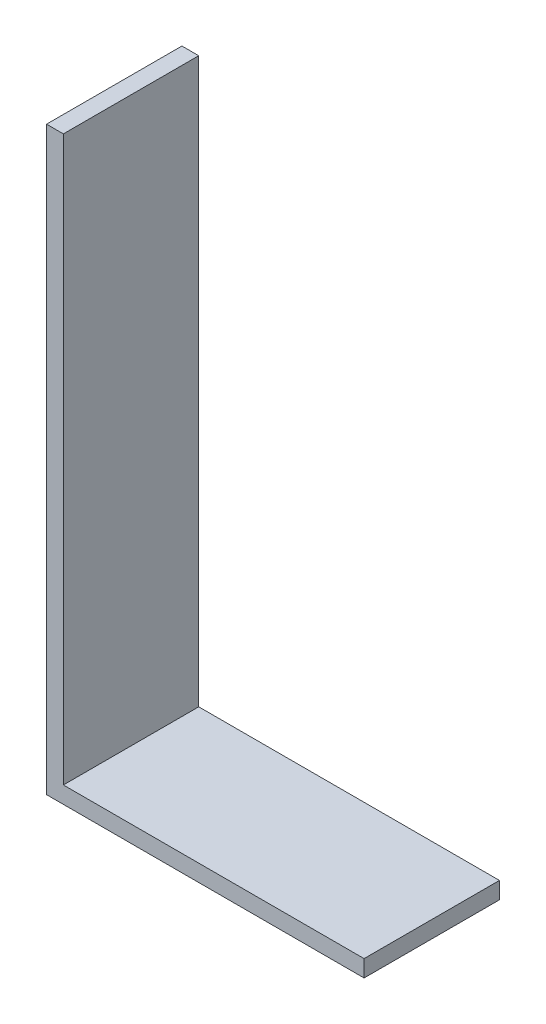
ISO-10303-21;
HEADER;
FILE_DESCRIPTION(('STEP AP214'),'2;1');
FILE_NAME('part.step','',(''),(''),'','','');
FILE_SCHEMA(('AUTOMOTIVE_DESIGN { 1 0 10303 214 1 1 1 1 }'));
ENDSEC;
DATA;
#1=APPLICATION_CONTEXT('core data for automotive mechanical design processes');
#2=APPLICATION_PROTOCOL_DEFINITION('international standard','automotive_design',2000,#1);
#3=PRODUCT_CONTEXT('',#1,'mechanical');
#4=PRODUCT('Part','Part','',(#3));
#5=PRODUCT_RELATED_PRODUCT_CATEGORY('part','',(#4));
#6=PRODUCT_DEFINITION_FORMATION('','',#4);
#7=PRODUCT_DEFINITION_CONTEXT('part definition',#1,'design');
#8=PRODUCT_DEFINITION('design','',#6,#7);
#9=PRODUCT_DEFINITION_SHAPE('','',#8);
#10=(LENGTH_UNIT() NAMED_UNIT(*) SI_UNIT(.MILLI.,.METRE.));
#11=(NAMED_UNIT(*) PLANE_ANGLE_UNIT() SI_UNIT($,.RADIAN.));
#12=(NAMED_UNIT(*) SI_UNIT($,.STERADIAN.) SOLID_ANGLE_UNIT());
#13=UNCERTAINTY_MEASURE_WITH_UNIT(LENGTH_MEASURE(1.E-05),#10,'distance_accuracy_value','');
#14=(GEOMETRIC_REPRESENTATION_CONTEXT(3) GLOBAL_UNCERTAINTY_ASSIGNED_CONTEXT((#13)) GLOBAL_UNIT_ASSIGNED_CONTEXT((#10,
#11,#12)) REPRESENTATION_CONTEXT('',''));
#15=CARTESIAN_POINT('',(0.,0.,0.));
#16=DIRECTION('',(0.,0.,1.));
#17=DIRECTION('',(1.,0.,0.));
#18=AXIS2_PLACEMENT_3D('',#15,#16,#17);
#19=CARTESIAN_POINT('',(6.3100000000001,6.30999999999991,50.8));
#20=DIRECTION('',(0.,-1.,0.));
#21=DIRECTION('',(1.,0.,0.));
#22=AXIS2_PLACEMENT_3D('',#19,#20,#21);
#23=PLANE('',#22);
#24=DIRECTION('',(-1.,0.,0.));
#25=VECTOR('',#24,1.);
#26=CARTESIAN_POINT('',(6.3100000000001,6.30999999999991,0.));
#27=LINE('',#26,#25);
#28=CARTESIAN_POINT('',(119.155,6.30999999999983,0.));
#29=VERTEX_POINT('',#28);
#30=CARTESIAN_POINT('',(6.3100000000001,6.30999999999991,0.));
#31=VERTEX_POINT('',#30);
#32=EDGE_CURVE('E117',#29,#31,#27,.T.);
#33=ORIENTED_EDGE('',*,*,#32,.T.);
#34=DIRECTION('',(0.,0.,-1.));
#35=VECTOR('',#34,1.);
#36=CARTESIAN_POINT('',(6.3100000000001,6.30999999999991,50.8));
#37=LINE('',#36,#35);
#38=CARTESIAN_POINT('',(6.3100000000001,6.30999999999991,50.8));
#39=VERTEX_POINT('',#38);
#40=EDGE_CURVE('E11',#39,#31,#37,.T.);
#41=ORIENTED_EDGE('',*,*,#40,.F.);
#42=DIRECTION('',(-1.,0.,0.));
#43=VECTOR('',#42,1.);
#44=CARTESIAN_POINT('',(6.3100000000001,6.30999999999991,50.8));
#45=LINE('',#44,#43);
#46=CARTESIAN_POINT('',(119.155,6.30999999999983,50.8));
#47=VERTEX_POINT('',#46);
#48=EDGE_CURVE('E127',#47,#39,#45,.T.);
#49=ORIENTED_EDGE('',*,*,#48,.F.);
#50=DIRECTION('',(0.,0.,-1.));
#51=VECTOR('',#50,1.);
#52=CARTESIAN_POINT('',(119.155,6.30999999999983,50.8));
#53=LINE('',#52,#51);
#54=EDGE_CURVE('E113',#47,#29,#53,.T.);
#55=ORIENTED_EDGE('',*,*,#54,.T.);
#56=EDGE_LOOP('',(#33,#41,#49,#55));
#57=FACE_BOUND('',#56,.T.);
#58=ADVANCED_FACE('F33',(#57),#23,.F.);
#59=CARTESIAN_POINT('',(6.31000000000007,217.90628726,50.8));
#60=DIRECTION('',(-1.,0.,0.));
#61=DIRECTION('',(0.,-1.,0.));
#62=AXIS2_PLACEMENT_3D('',#59,#60,#61);
#63=PLANE('',#62);
#64=DIRECTION('',(0.,1.,0.));
#65=VECTOR('',#64,1.);
#66=CARTESIAN_POINT('',(6.31000000000007,217.90628726,0.));
#67=LINE('',#66,#65);
#68=CARTESIAN_POINT('',(6.31000000000007,217.90628726,0.));
#69=VERTEX_POINT('',#68);
#70=EDGE_CURVE('E120',#31,#69,#67,.T.);
#71=ORIENTED_EDGE('',*,*,#70,.T.);
#72=DIRECTION('',(0.,0.,-1.));
#73=VECTOR('',#72,1.);
#74=CARTESIAN_POINT('',(6.31000000000007,217.90628726,50.8));
#75=LINE('',#74,#73);
#76=CARTESIAN_POINT('',(6.31000000000007,217.90628726,50.8));
#77=VERTEX_POINT('',#76);
#78=EDGE_CURVE('E41',#77,#69,#75,.T.);
#79=ORIENTED_EDGE('',*,*,#78,.F.);
#80=DIRECTION('',(0.,1.,0.));
#81=VECTOR('',#80,1.);
#82=CARTESIAN_POINT('',(6.31000000000007,217.90628726,50.8));
#83=LINE('',#82,#81);
#84=EDGE_CURVE('E86',#39,#77,#83,.T.);
#85=ORIENTED_EDGE('',*,*,#84,.F.);
#86=ORIENTED_EDGE('',*,*,#40,.T.);
#87=EDGE_LOOP('',(#71,#79,#85,#86));
#88=FACE_BOUND('',#87,.T.);
#89=ADVANCED_FACE('F151',(#88),#63,.F.);
#90=CARTESIAN_POINT('',(0.,217.90628726,50.8));
#91=DIRECTION('',(0.,-1.,0.));
#92=DIRECTION('',(0.,0.,-1.));
#93=AXIS2_PLACEMENT_3D('',#90,#91,#92);
#94=PLANE('',#93);
#95=DIRECTION('',(-1.,0.,0.));
#96=VECTOR('',#95,1.);
#97=CARTESIAN_POINT('',(0.,217.90628726,0.));
#98=LINE('',#97,#96);
#99=CARTESIAN_POINT('',(0.,217.90628726,0.));
#100=VERTEX_POINT('',#99);
#101=EDGE_CURVE('E122',#69,#100,#98,.T.);
#102=ORIENTED_EDGE('',*,*,#101,.T.);
#103=DIRECTION('',(0.,0.,-1.));
#104=VECTOR('',#103,1.);
#105=CARTESIAN_POINT('',(0.,217.90628726,50.8));
#106=LINE('',#105,#104);
#107=CARTESIAN_POINT('',(0.,217.90628726,50.8));
#108=VERTEX_POINT('',#107);
#109=EDGE_CURVE('E108',#108,#100,#106,.T.);
#110=ORIENTED_EDGE('',*,*,#109,.F.);
#111=DIRECTION('',(-1.,0.,0.));
#112=VECTOR('',#111,1.);
#113=CARTESIAN_POINT('',(0.,217.90628726,50.8));
#114=LINE('',#113,#112);
#115=EDGE_CURVE('E99',#77,#108,#114,.T.);
#116=ORIENTED_EDGE('',*,*,#115,.F.);
#117=ORIENTED_EDGE('',*,*,#78,.T.);
#118=EDGE_LOOP('',(#102,#110,#116,#117));
#119=FACE_BOUND('',#118,.T.);
#120=ADVANCED_FACE('F133',(#119),#94,.F.);
#121=CARTESIAN_POINT('',(0.,0.,50.8));
#122=DIRECTION('',(1.,0.,0.));
#123=DIRECTION('',(0.,0.,-1.));
#124=AXIS2_PLACEMENT_3D('',#121,#122,#123);
#125=PLANE('',#124);
#126=DIRECTION('',(0.,-1.,0.));
#127=VECTOR('',#126,1.);
#128=CARTESIAN_POINT('',(0.,0.,0.));
#129=LINE('',#128,#127);
#130=CARTESIAN_POINT('',(0.,0.,0.));
#131=VERTEX_POINT('',#130);
#132=EDGE_CURVE('E107',#100,#131,#129,.T.);
#133=ORIENTED_EDGE('',*,*,#132,.T.);
#134=DIRECTION('',(0.,0.,-1.));
#135=VECTOR('',#134,1.);
#136=CARTESIAN_POINT('',(0.,0.,50.8));
#137=LINE('',#136,#135);
#138=CARTESIAN_POINT('',(0.,0.,50.8));
#139=VERTEX_POINT('',#138);
#140=EDGE_CURVE('E104',#139,#131,#137,.T.);
#141=ORIENTED_EDGE('',*,*,#140,.F.);
#142=DIRECTION('',(0.,-1.,0.));
#143=VECTOR('',#142,1.);
#144=CARTESIAN_POINT('',(0.,0.,50.8));
#145=LINE('',#144,#143);
#146=EDGE_CURVE('E93',#108,#139,#145,.T.);
#147=ORIENTED_EDGE('',*,*,#146,.F.);
#148=ORIENTED_EDGE('',*,*,#109,.T.);
#149=EDGE_LOOP('',(#133,#141,#147,#148));
#150=FACE_BOUND('',#149,.T.);
#151=ADVANCED_FACE('F105',(#150),#125,.F.);
#152=CARTESIAN_POINT('',(119.155,0.,50.8));
#153=DIRECTION('',(0.,1.,0.));
#154=DIRECTION('',(-1.,0.,0.));
#155=AXIS2_PLACEMENT_3D('',#152,#153,#154);
#156=PLANE('',#155);
#157=DIRECTION('',(1.,0.,0.));
#158=VECTOR('',#157,1.);
#159=CARTESIAN_POINT('',(119.155,0.,0.));
#160=LINE('',#159,#158);
#161=CARTESIAN_POINT('',(119.155,0.,0.));
#162=VERTEX_POINT('',#161);
#163=EDGE_CURVE('E72',#131,#162,#160,.T.);
#164=ORIENTED_EDGE('',*,*,#163,.T.);
#165=DIRECTION('',(0.,0.,-1.));
#166=VECTOR('',#165,1.);
#167=CARTESIAN_POINT('',(119.155,0.,50.8));
#168=LINE('',#167,#166);
#169=CARTESIAN_POINT('',(119.155,0.,50.8));
#170=VERTEX_POINT('',#169);
#171=EDGE_CURVE('E109',#170,#162,#168,.T.);
#172=ORIENTED_EDGE('',*,*,#171,.F.);
#173=DIRECTION('',(1.,0.,0.));
#174=VECTOR('',#173,1.);
#175=CARTESIAN_POINT('',(119.155,0.,50.8));
#176=LINE('',#175,#174);
#177=EDGE_CURVE('E97',#139,#170,#176,.T.);
#178=ORIENTED_EDGE('',*,*,#177,.F.);
#179=ORIENTED_EDGE('',*,*,#140,.T.);
#180=EDGE_LOOP('',(#164,#172,#178,#179));
#181=FACE_BOUND('',#180,.T.);
#182=ADVANCED_FACE('F111',(#181),#156,.F.);
#183=CARTESIAN_POINT('',(119.155,6.30999999999983,50.8));
#184=DIRECTION('',(-1.,0.,0.));
#185=DIRECTION('',(0.,0.,1.));
#186=AXIS2_PLACEMENT_3D('',#183,#184,#185);
#187=PLANE('',#186);
#188=DIRECTION('',(0.,1.,0.));
#189=VECTOR('',#188,1.);
#190=CARTESIAN_POINT('',(119.155,6.30999999999983,0.));
#191=LINE('',#190,#189);
#192=EDGE_CURVE('E78',#162,#29,#191,.T.);
#193=ORIENTED_EDGE('',*,*,#192,.T.);
#194=ORIENTED_EDGE('',*,*,#54,.F.);
#195=DIRECTION('',(0.,1.,0.));
#196=VECTOR('',#195,1.);
#197=CARTESIAN_POINT('',(119.155,6.30999999999983,50.8));
#198=LINE('',#197,#196);
#199=EDGE_CURVE('E49',#170,#47,#198,.T.);
#200=ORIENTED_EDGE('',*,*,#199,.F.);
#201=ORIENTED_EDGE('',*,*,#171,.T.);
#202=EDGE_LOOP('',(#193,#194,#200,#201));
#203=FACE_BOUND('',#202,.T.);
#204=ADVANCED_FACE('F140',(#203),#187,.F.);
#205=CARTESIAN_POINT('',(0.,0.,50.8));
#206=DIRECTION('',(0.,0.,-1.));
#207=DIRECTION('',(-1.,0.,0.));
#208=AXIS2_PLACEMENT_3D('',#205,#206,#207);
#209=PLANE('',#208);
#210=ORIENTED_EDGE('',*,*,#48,.T.);
#211=ORIENTED_EDGE('',*,*,#84,.T.);
#212=ORIENTED_EDGE('',*,*,#115,.T.);
#213=ORIENTED_EDGE('',*,*,#146,.T.);
#214=ORIENTED_EDGE('',*,*,#177,.T.);
#215=ORIENTED_EDGE('',*,*,#199,.T.);
#216=EDGE_LOOP('',(#210,#211,#212,#213,#214,#215));
#217=FACE_BOUND('',#216,.T.);
#218=ADVANCED_FACE('F95',(#217),#209,.F.);
#219=CARTESIAN_POINT('',(0.,0.,0.));
#220=DIRECTION('',(0.,0.,-1.));
#221=DIRECTION('',(-1.,0.,0.));
#222=AXIS2_PLACEMENT_3D('',#219,#220,#221);
#223=PLANE('',#222);
#224=ORIENTED_EDGE('',*,*,#32,.F.);
#225=ORIENTED_EDGE('',*,*,#192,.F.);
#226=ORIENTED_EDGE('',*,*,#163,.F.);
#227=ORIENTED_EDGE('',*,*,#132,.F.);
#228=ORIENTED_EDGE('',*,*,#101,.F.);
#229=ORIENTED_EDGE('',*,*,#70,.F.);
#230=EDGE_LOOP('',(#224,#225,#226,#227,#228,#229));
#231=FACE_BOUND('',#230,.T.);
#232=ADVANCED_FACE('F136',(#231),#223,.T.);
#233=CLOSED_SHELL('',(#58,#89,#120,#151,#182,#204,#218,#232));
#234=MANIFOLD_SOLID_BREP('B2',#233);
#235=ADVANCED_BREP_SHAPE_REPRESENTATION('',(#18,#234),#14);
#236=SHAPE_DEFINITION_REPRESENTATION(#9,#235);
ENDSEC;
END-ISO-10303-21;
